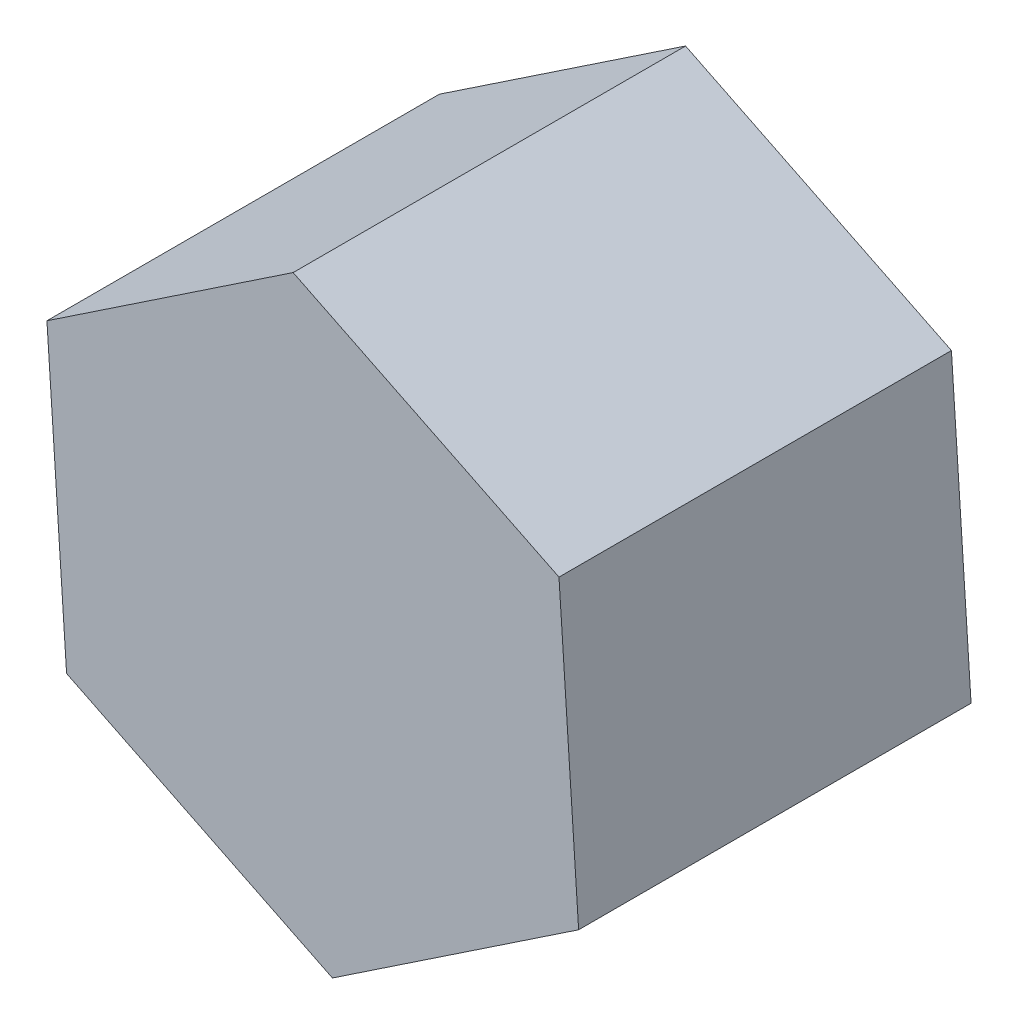
ISO-10303-21;
HEADER;
FILE_DESCRIPTION(('STEP AP214'),'2;1');
FILE_NAME('part.step','',(''),(''),'','','');
FILE_SCHEMA(('AUTOMOTIVE_DESIGN { 1 0 10303 214 1 1 1 1 }'));
ENDSEC;
DATA;
#1=APPLICATION_CONTEXT('core data for automotive mechanical design processes');
#2=APPLICATION_PROTOCOL_DEFINITION('international standard','automotive_design',2000,#1);
#3=PRODUCT_CONTEXT('',#1,'mechanical');
#4=PRODUCT('Part','Part','',(#3));
#5=PRODUCT_RELATED_PRODUCT_CATEGORY('part','',(#4));
#6=PRODUCT_DEFINITION_FORMATION('','',#4);
#7=PRODUCT_DEFINITION_CONTEXT('part definition',#1,'design');
#8=PRODUCT_DEFINITION('design','',#6,#7);
#9=PRODUCT_DEFINITION_SHAPE('','',#8);
#10=(LENGTH_UNIT() NAMED_UNIT(*) SI_UNIT(.MILLI.,.METRE.));
#11=(NAMED_UNIT(*) PLANE_ANGLE_UNIT() SI_UNIT($,.RADIAN.));
#12=(NAMED_UNIT(*) SI_UNIT($,.STERADIAN.) SOLID_ANGLE_UNIT());
#13=UNCERTAINTY_MEASURE_WITH_UNIT(LENGTH_MEASURE(1.E-05),#10,'distance_accuracy_value','');
#14=(GEOMETRIC_REPRESENTATION_CONTEXT(3) GLOBAL_UNCERTAINTY_ASSIGNED_CONTEXT((#13)) GLOBAL_UNIT_ASSIGNED_CONTEXT((#10,
#11,#12)) REPRESENTATION_CONTEXT('',''));
#15=CARTESIAN_POINT('',(0.,0.,0.));
#16=DIRECTION('',(0.,0.,1.));
#17=DIRECTION('',(1.,0.,0.));
#18=AXIS2_PLACEMENT_3D('',#15,#16,#17);
#19=CARTESIAN_POINT('',(2.50368892680362,-37.6668714867474,50.));
#20=DIRECTION('',(-0.556336426591273,0.830957147178874,0.));
#21=DIRECTION('',(-0.830957147178874,-0.556336426591273,0.));
#22=AXIS2_PLACEMENT_3D('',#19,#20,#21);
#23=PLANE('',#22);
#24=DIRECTION('',(0.830957147178874,0.556336426591273,0.));
#25=VECTOR('',#24,1.);
#26=CARTESIAN_POINT('',(2.50368892680362,-37.6668714867474,0.));
#27=LINE('',#26,#25);
#28=CARTESIAN_POINT('',(2.50368892680362,-37.6668714867474,0.));
#29=VERTEX_POINT('',#28);
#30=CARTESIAN_POINT('',(33.8723120520087,-16.6651775295879,0.));
#31=VERTEX_POINT('',#30);
#32=EDGE_CURVE('E132',#29,#31,#27,.T.);
#33=ORIENTED_EDGE('',*,*,#32,.T.);
#34=DIRECTION('',(0.,0.,-1.));
#35=VECTOR('',#34,1.);
#36=CARTESIAN_POINT('',(33.8723120520087,-16.6651775295879,50.));
#37=LINE('',#36,#35);
#38=CARTESIAN_POINT('',(33.8723120520087,-16.6651775295879,50.));
#39=VERTEX_POINT('',#38);
#40=EDGE_CURVE('E11',#39,#31,#37,.T.);
#41=ORIENTED_EDGE('',*,*,#40,.F.);
#42=DIRECTION('',(0.830957147178874,0.556336426591273,0.));
#43=VECTOR('',#42,1.);
#44=CARTESIAN_POINT('',(2.50368892680362,-37.6668714867474,50.));
#45=LINE('',#44,#43);
#46=CARTESIAN_POINT('',(2.50368892680362,-37.6668714867474,50.));
#47=VERTEX_POINT('',#46);
#48=EDGE_CURVE('E148',#47,#39,#45,.T.);
#49=ORIENTED_EDGE('',*,*,#48,.F.);
#50=DIRECTION('',(0.,0.,-1.));
#51=VECTOR('',#50,1.);
#52=CARTESIAN_POINT('',(2.50368892680362,-37.6668714867474,50.));
#53=LINE('',#52,#51);
#54=EDGE_CURVE('E128',#47,#29,#53,.T.);
#55=ORIENTED_EDGE('',*,*,#54,.T.);
#56=EDGE_LOOP('',(#33,#41,#49,#55));
#57=FACE_BOUND('',#56,.T.);
#58=ADVANCED_FACE('F43',(#57),#23,.F.);
#59=CARTESIAN_POINT('',(33.8723120520087,-16.6651775295879,50.));
#60=DIRECTION('',(-0.997798212208786,-0.0663229048892612,0.));
#61=DIRECTION('',(0.0663229048892612,-0.997798212208786,0.));
#62=AXIS2_PLACEMENT_3D('',#59,#60,#61);
#63=PLANE('',#62);
#64=DIRECTION('',(-0.0663229048892612,0.997798212208786,0.));
#65=VECTOR('',#64,1.);
#66=CARTESIAN_POINT('',(33.8723120520087,-16.6651775295879,0.));
#67=LINE('',#66,#65);
#68=CARTESIAN_POINT('',(31.3686231252051,21.0016939571594,0.));
#69=VERTEX_POINT('',#68);
#70=EDGE_CURVE('E136',#31,#69,#67,.T.);
#71=ORIENTED_EDGE('',*,*,#70,.T.);
#72=DIRECTION('',(0.,0.,-1.));
#73=VECTOR('',#72,1.);
#74=CARTESIAN_POINT('',(31.3686231252051,21.0016939571594,50.));
#75=LINE('',#74,#73);
#76=CARTESIAN_POINT('',(31.3686231252051,21.0016939571594,50.));
#77=VERTEX_POINT('',#76);
#78=EDGE_CURVE('E52',#77,#69,#75,.T.);
#79=ORIENTED_EDGE('',*,*,#78,.F.);
#80=DIRECTION('',(-0.0663229048892612,0.997798212208786,0.));
#81=VECTOR('',#80,1.);
#82=CARTESIAN_POINT('',(33.8723120520087,-16.6651775295879,50.));
#83=LINE('',#82,#81);
#84=EDGE_CURVE('E97',#39,#77,#83,.T.);
#85=ORIENTED_EDGE('',*,*,#84,.F.);
#86=ORIENTED_EDGE('',*,*,#40,.T.);
#87=EDGE_LOOP('',(#71,#79,#85,#86));
#88=FACE_BOUND('',#87,.T.);
#89=ADVANCED_FACE('F176',(#88),#63,.F.);
#90=CARTESIAN_POINT('',(31.3686231252051,21.0016939571594,50.));
#91=DIRECTION('',(-0.441461785617513,-0.897280052068136,0.));
#92=DIRECTION('',(0.897280052068136,-0.441461785617513,0.));
#93=AXIS2_PLACEMENT_3D('',#90,#91,#92);
#94=PLANE('',#93);
#95=DIRECTION('',(-0.897280052068136,0.441461785617513,0.));
#96=VECTOR('',#95,1.);
#97=CARTESIAN_POINT('',(31.3686231252051,21.0016939571594,0.));
#98=LINE('',#97,#96);
#99=CARTESIAN_POINT('',(-2.50368892680362,37.6668714867474,0.));
#100=VERTEX_POINT('',#99);
#101=EDGE_CURVE('E139',#69,#100,#98,.T.);
#102=ORIENTED_EDGE('',*,*,#101,.T.);
#103=DIRECTION('',(0.,0.,-1.));
#104=VECTOR('',#103,1.);
#105=CARTESIAN_POINT('',(-2.50368892680362,37.6668714867474,50.));
#106=LINE('',#105,#104);
#107=CARTESIAN_POINT('',(-2.50368892680362,37.6668714867474,50.));
#108=VERTEX_POINT('',#107);
#109=EDGE_CURVE('E121',#108,#100,#106,.T.);
#110=ORIENTED_EDGE('',*,*,#109,.F.);
#111=DIRECTION('',(-0.897280052068136,0.441461785617513,0.));
#112=VECTOR('',#111,1.);
#113=CARTESIAN_POINT('',(31.3686231252051,21.0016939571594,50.));
#114=LINE('',#113,#112);
#115=EDGE_CURVE('E110',#77,#108,#114,.T.);
#116=ORIENTED_EDGE('',*,*,#115,.F.);
#117=ORIENTED_EDGE('',*,*,#78,.T.);
#118=EDGE_LOOP('',(#102,#110,#116,#117));
#119=FACE_BOUND('',#118,.T.);
#120=ADVANCED_FACE('F158',(#119),#94,.F.);
#121=CARTESIAN_POINT('',(-2.50368892680362,37.6668714867474,50.));
#122=DIRECTION('',(0.556336426591273,-0.830957147178874,0.));
#123=DIRECTION('',(0.830957147178874,0.556336426591273,0.));
#124=AXIS2_PLACEMENT_3D('',#121,#122,#123);
#125=PLANE('',#124);
#126=DIRECTION('',(-0.830957147178874,-0.556336426591273,0.));
#127=VECTOR('',#126,1.);
#128=CARTESIAN_POINT('',(-2.50368892680362,37.6668714867474,0.));
#129=LINE('',#128,#127);
#130=CARTESIAN_POINT('',(-33.8723120520088,16.665177529588,0.));
#131=VERTEX_POINT('',#130);
#132=EDGE_CURVE('E119',#100,#131,#129,.T.);
#133=ORIENTED_EDGE('',*,*,#132,.T.);
#134=DIRECTION('',(0.,0.,-1.));
#135=VECTOR('',#134,1.);
#136=CARTESIAN_POINT('',(-33.8723120520088,16.665177529588,50.));
#137=LINE('',#136,#135);
#138=CARTESIAN_POINT('',(-33.8723120520088,16.665177529588,50.));
#139=VERTEX_POINT('',#138);
#140=EDGE_CURVE('E116',#139,#131,#137,.T.);
#141=ORIENTED_EDGE('',*,*,#140,.F.);
#142=DIRECTION('',(-0.830957147178874,-0.556336426591273,0.));
#143=VECTOR('',#142,1.);
#144=CARTESIAN_POINT('',(-2.50368892680362,37.6668714867474,50.));
#145=LINE('',#144,#143);
#146=EDGE_CURVE('E104',#108,#139,#145,.T.);
#147=ORIENTED_EDGE('',*,*,#146,.F.);
#148=ORIENTED_EDGE('',*,*,#109,.T.);
#149=EDGE_LOOP('',(#133,#141,#147,#148));
#150=FACE_BOUND('',#149,.T.);
#151=ADVANCED_FACE('F117',(#150),#125,.F.);
#152=CARTESIAN_POINT('',(-33.8723120520088,16.665177529588,50.));
#153=DIRECTION('',(0.997798212208786,0.0663229048892619,0.));
#154=DIRECTION('',(-0.0663229048892619,0.997798212208786,0.));
#155=AXIS2_PLACEMENT_3D('',#152,#153,#154);
#156=PLANE('',#155);
#157=DIRECTION('',(0.0663229048892619,-0.997798212208786,0.));
#158=VECTOR('',#157,1.);
#159=CARTESIAN_POINT('',(-33.8723120520088,16.665177529588,0.));
#160=LINE('',#159,#158);
#161=CARTESIAN_POINT('',(-31.3686231252052,-21.0016939571594,0.));
#162=VERTEX_POINT('',#161);
#163=EDGE_CURVE('E83',#131,#162,#160,.T.);
#164=ORIENTED_EDGE('',*,*,#163,.T.);
#165=DIRECTION('',(0.,0.,-1.));
#166=VECTOR('',#165,1.);
#167=CARTESIAN_POINT('',(-31.3686231252052,-21.0016939571594,50.));
#168=LINE('',#167,#166);
#169=CARTESIAN_POINT('',(-31.3686231252052,-21.0016939571594,50.));
#170=VERTEX_POINT('',#169);
#171=EDGE_CURVE('E122',#170,#162,#168,.T.);
#172=ORIENTED_EDGE('',*,*,#171,.F.);
#173=DIRECTION('',(0.0663229048892619,-0.997798212208786,0.));
#174=VECTOR('',#173,1.);
#175=CARTESIAN_POINT('',(-33.8723120520088,16.665177529588,50.));
#176=LINE('',#175,#174);
#177=EDGE_CURVE('E108',#139,#170,#176,.T.);
#178=ORIENTED_EDGE('',*,*,#177,.F.);
#179=ORIENTED_EDGE('',*,*,#140,.T.);
#180=EDGE_LOOP('',(#164,#172,#178,#179));
#181=FACE_BOUND('',#180,.T.);
#182=ADVANCED_FACE('F124',(#181),#156,.F.);
#183=CARTESIAN_POINT('',(-31.3686231252052,-21.0016939571594,50.));
#184=DIRECTION('',(0.441461785617513,0.897280052068136,0.));
#185=DIRECTION('',(-0.897280052068136,0.441461785617513,0.));
#186=AXIS2_PLACEMENT_3D('',#183,#184,#185);
#187=PLANE('',#186);
#188=DIRECTION('',(0.897280052068136,-0.441461785617513,0.));
#189=VECTOR('',#188,1.);
#190=CARTESIAN_POINT('',(-31.3686231252052,-21.0016939571594,0.));
#191=LINE('',#190,#189);
#192=EDGE_CURVE('E89',#162,#29,#191,.T.);
#193=ORIENTED_EDGE('',*,*,#192,.T.);
#194=ORIENTED_EDGE('',*,*,#54,.F.);
#195=DIRECTION('',(0.897280052068136,-0.441461785617513,0.));
#196=VECTOR('',#195,1.);
#197=CARTESIAN_POINT('',(-31.3686231252052,-21.0016939571594,50.));
#198=LINE('',#197,#196);
#199=EDGE_CURVE('E60',#170,#47,#198,.T.);
#200=ORIENTED_EDGE('',*,*,#199,.F.);
#201=ORIENTED_EDGE('',*,*,#171,.T.);
#202=EDGE_LOOP('',(#193,#194,#200,#201));
#203=FACE_BOUND('',#202,.T.);
#204=ADVANCED_FACE('F165',(#203),#187,.F.);
#205=CARTESIAN_POINT('',(0.,0.,50.));
#206=DIRECTION('',(0.,0.,1.));
#207=DIRECTION('',(1.,0.,0.));
#208=AXIS2_PLACEMENT_3D('',#205,#206,#207);
#209=PLANE('',#208);
#210=ORIENTED_EDGE('',*,*,#48,.T.);
#211=ORIENTED_EDGE('',*,*,#84,.T.);
#212=ORIENTED_EDGE('',*,*,#115,.T.);
#213=ORIENTED_EDGE('',*,*,#146,.T.);
#214=ORIENTED_EDGE('',*,*,#177,.T.);
#215=ORIENTED_EDGE('',*,*,#199,.T.);
#216=EDGE_LOOP('',(#210,#211,#212,#213,#214,#215));
#217=FACE_BOUND('',#216,.T.);
#218=ADVANCED_FACE('F106',(#217),#209,.T.);
#219=CARTESIAN_POINT('',(0.,0.,0.));
#220=DIRECTION('',(0.,0.,1.));
#221=DIRECTION('',(1.,0.,0.));
#222=AXIS2_PLACEMENT_3D('',#219,#220,#221);
#223=PLANE('',#222);
#224=ORIENTED_EDGE('',*,*,#32,.F.);
#225=ORIENTED_EDGE('',*,*,#192,.F.);
#226=ORIENTED_EDGE('',*,*,#163,.F.);
#227=ORIENTED_EDGE('',*,*,#132,.F.);
#228=ORIENTED_EDGE('',*,*,#101,.F.);
#229=ORIENTED_EDGE('',*,*,#70,.F.);
#230=EDGE_LOOP('',(#224,#225,#226,#227,#228,#229));
#231=FACE_BOUND('',#230,.T.);
#232=ADVANCED_FACE('F161',(#231),#223,.F.);
#233=CLOSED_SHELL('',(#58,#89,#120,#151,#182,#204,#218,#232));
#234=MANIFOLD_SOLID_BREP('B2',#233);
#235=ADVANCED_BREP_SHAPE_REPRESENTATION('',(#18,#234),#14);
#236=SHAPE_DEFINITION_REPRESENTATION(#9,#235);
ENDSEC;
END-ISO-10303-21;
